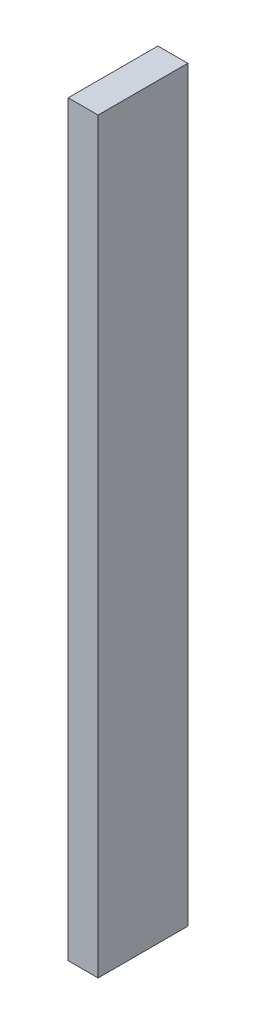
ISO-10303-21;
HEADER;
FILE_DESCRIPTION(('STEP AP214'),'2;1');
FILE_NAME('part.step','',(''),(''),'','','');
FILE_SCHEMA(('AUTOMOTIVE_DESIGN { 1 0 10303 214 1 1 1 1 }'));
ENDSEC;
DATA;
#1=APPLICATION_CONTEXT('core data for automotive mechanical design processes');
#2=APPLICATION_PROTOCOL_DEFINITION('international standard','automotive_design',2000,#1);
#3=PRODUCT_CONTEXT('',#1,'mechanical');
#4=PRODUCT('Part','Part','',(#3));
#5=PRODUCT_RELATED_PRODUCT_CATEGORY('part','',(#4));
#6=PRODUCT_DEFINITION_FORMATION('','',#4);
#7=PRODUCT_DEFINITION_CONTEXT('part definition',#1,'design');
#8=PRODUCT_DEFINITION('design','',#6,#7);
#9=PRODUCT_DEFINITION_SHAPE('','',#8);
#10=(LENGTH_UNIT() NAMED_UNIT(*) SI_UNIT(.MILLI.,.METRE.));
#11=(NAMED_UNIT(*) PLANE_ANGLE_UNIT() SI_UNIT($,.RADIAN.));
#12=(NAMED_UNIT(*) SI_UNIT($,.STERADIAN.) SOLID_ANGLE_UNIT());
#13=UNCERTAINTY_MEASURE_WITH_UNIT(LENGTH_MEASURE(1.E-05),#10,'distance_accuracy_value','');
#14=(GEOMETRIC_REPRESENTATION_CONTEXT(3) GLOBAL_UNCERTAINTY_ASSIGNED_CONTEXT((#13)) GLOBAL_UNIT_ASSIGNED_CONTEXT((#10,
#11,#12)) REPRESENTATION_CONTEXT('',''));
#15=CARTESIAN_POINT('',(0.,0.,0.));
#16=DIRECTION('',(0.,0.,1.));
#17=DIRECTION('',(1.,0.,0.));
#18=AXIS2_PLACEMENT_3D('',#15,#16,#17);
#19=CARTESIAN_POINT('',(10.,500.,30.));
#20=DIRECTION('',(-1.,0.,0.));
#21=DIRECTION('',(0.,0.,1.));
#22=AXIS2_PLACEMENT_3D('',#19,#20,#21);
#23=PLANE('',#22);
#24=DIRECTION('',(0.,0.,-1.));
#25=VECTOR('',#24,1.);
#26=CARTESIAN_POINT('',(10.,0.,30.));
#27=LINE('',#26,#25);
#28=CARTESIAN_POINT('',(10.,0.,30.));
#29=VERTEX_POINT('',#28);
#30=CARTESIAN_POINT('',(10.,0.,-30.));
#31=VERTEX_POINT('',#30);
#32=EDGE_CURVE('E107',#29,#31,#27,.T.);
#33=ORIENTED_EDGE('',*,*,#32,.T.);
#34=DIRECTION('',(0.,-1.,0.));
#35=VECTOR('',#34,1.);
#36=CARTESIAN_POINT('',(10.,500.,-30.));
#37=LINE('',#36,#35);
#38=CARTESIAN_POINT('',(10.,500.,-30.));
#39=VERTEX_POINT('',#38);
#40=EDGE_CURVE('E11',#39,#31,#37,.T.);
#41=ORIENTED_EDGE('',*,*,#40,.F.);
#42=DIRECTION('',(0.,0.,-1.));
#43=VECTOR('',#42,1.);
#44=CARTESIAN_POINT('',(10.,500.,30.));
#45=LINE('',#44,#43);
#46=CARTESIAN_POINT('',(10.,500.,30.));
#47=VERTEX_POINT('',#46);
#48=EDGE_CURVE('E91',#47,#39,#45,.T.);
#49=ORIENTED_EDGE('',*,*,#48,.F.);
#50=DIRECTION('',(0.,-1.,0.));
#51=VECTOR('',#50,1.);
#52=CARTESIAN_POINT('',(10.,500.,30.));
#53=LINE('',#52,#51);
#54=EDGE_CURVE('E103',#47,#29,#53,.T.);
#55=ORIENTED_EDGE('',*,*,#54,.T.);
#56=EDGE_LOOP('',(#33,#41,#49,#55));
#57=FACE_BOUND('',#56,.T.);
#58=ADVANCED_FACE('F39',(#57),#23,.F.);
#59=CARTESIAN_POINT('',(-10.,500.,-30.));
#60=DIRECTION('',(0.,0.,1.));
#61=DIRECTION('',(1.,0.,0.));
#62=AXIS2_PLACEMENT_3D('',#59,#60,#61);
#63=PLANE('',#62);
#64=DIRECTION('',(-1.,0.,0.));
#65=VECTOR('',#64,1.);
#66=CARTESIAN_POINT('',(-10.,0.,-30.));
#67=LINE('',#66,#65);
#68=CARTESIAN_POINT('',(-10.,0.,-30.));
#69=VERTEX_POINT('',#68);
#70=EDGE_CURVE('E96',#31,#69,#67,.T.);
#71=ORIENTED_EDGE('',*,*,#70,.T.);
#72=DIRECTION('',(0.,-1.,0.));
#73=VECTOR('',#72,1.);
#74=CARTESIAN_POINT('',(-10.,500.,-30.));
#75=LINE('',#74,#73);
#76=CARTESIAN_POINT('',(-10.,500.,-30.));
#77=VERTEX_POINT('',#76);
#78=EDGE_CURVE('E48',#77,#69,#75,.T.);
#79=ORIENTED_EDGE('',*,*,#78,.F.);
#80=DIRECTION('',(-1.,0.,0.));
#81=VECTOR('',#80,1.);
#82=CARTESIAN_POINT('',(-10.,500.,-30.));
#83=LINE('',#82,#81);
#84=EDGE_CURVE('E86',#39,#77,#83,.T.);
#85=ORIENTED_EDGE('',*,*,#84,.F.);
#86=ORIENTED_EDGE('',*,*,#40,.T.);
#87=EDGE_LOOP('',(#71,#79,#85,#86));
#88=FACE_BOUND('',#87,.T.);
#89=ADVANCED_FACE('F95',(#88),#63,.F.);
#90=CARTESIAN_POINT('',(-10.,500.,30.));
#91=DIRECTION('',(1.,0.,0.));
#92=DIRECTION('',(0.,0.,-1.));
#93=AXIS2_PLACEMENT_3D('',#90,#91,#92);
#94=PLANE('',#93);
#95=DIRECTION('',(0.,0.,1.));
#96=VECTOR('',#95,1.);
#97=CARTESIAN_POINT('',(-10.,0.,30.));
#98=LINE('',#97,#96);
#99=CARTESIAN_POINT('',(-10.,0.,30.));
#100=VERTEX_POINT('',#99);
#101=EDGE_CURVE('E73',#69,#100,#98,.T.);
#102=ORIENTED_EDGE('',*,*,#101,.T.);
#103=DIRECTION('',(0.,-1.,0.));
#104=VECTOR('',#103,1.);
#105=CARTESIAN_POINT('',(-10.,500.,30.));
#106=LINE('',#105,#104);
#107=CARTESIAN_POINT('',(-10.,500.,30.));
#108=VERTEX_POINT('',#107);
#109=EDGE_CURVE('E98',#108,#100,#106,.T.);
#110=ORIENTED_EDGE('',*,*,#109,.F.);
#111=DIRECTION('',(0.,0.,1.));
#112=VECTOR('',#111,1.);
#113=CARTESIAN_POINT('',(-10.,500.,30.));
#114=LINE('',#113,#112);
#115=EDGE_CURVE('E89',#77,#108,#114,.T.);
#116=ORIENTED_EDGE('',*,*,#115,.F.);
#117=ORIENTED_EDGE('',*,*,#78,.T.);
#118=EDGE_LOOP('',(#102,#110,#116,#117));
#119=FACE_BOUND('',#118,.T.);
#120=ADVANCED_FACE('F99',(#119),#94,.F.);
#121=CARTESIAN_POINT('',(-10.,500.,30.));
#122=DIRECTION('',(0.,0.,-1.));
#123=DIRECTION('',(-1.,0.,0.));
#124=AXIS2_PLACEMENT_3D('',#121,#122,#123);
#125=PLANE('',#124);
#126=DIRECTION('',(1.,0.,0.));
#127=VECTOR('',#126,1.);
#128=CARTESIAN_POINT('',(-10.,0.,30.));
#129=LINE('',#128,#127);
#130=EDGE_CURVE('E79',#100,#29,#129,.T.);
#131=ORIENTED_EDGE('',*,*,#130,.T.);
#132=ORIENTED_EDGE('',*,*,#54,.F.);
#133=DIRECTION('',(1.,0.,0.));
#134=VECTOR('',#133,1.);
#135=CARTESIAN_POINT('',(-10.,500.,30.));
#136=LINE('',#135,#134);
#137=EDGE_CURVE('E56',#108,#47,#136,.T.);
#138=ORIENTED_EDGE('',*,*,#137,.F.);
#139=ORIENTED_EDGE('',*,*,#109,.T.);
#140=EDGE_LOOP('',(#131,#132,#138,#139));
#141=FACE_BOUND('',#140,.T.);
#142=ADVANCED_FACE('F120',(#141),#125,.F.);
#143=CARTESIAN_POINT('',(0.,500.,0.));
#144=DIRECTION('',(0.,-1.,0.));
#145=DIRECTION('',(0.,0.,-1.));
#146=AXIS2_PLACEMENT_3D('',#143,#144,#145);
#147=PLANE('',#146);
#148=ORIENTED_EDGE('',*,*,#48,.T.);
#149=ORIENTED_EDGE('',*,*,#84,.T.);
#150=ORIENTED_EDGE('',*,*,#115,.T.);
#151=ORIENTED_EDGE('',*,*,#137,.T.);
#152=EDGE_LOOP('',(#148,#149,#150,#151));
#153=FACE_BOUND('',#152,.T.);
#154=ADVANCED_FACE('F87',(#153),#147,.F.);
#155=CARTESIAN_POINT('',(0.,0.,0.));
#156=DIRECTION('',(0.,-1.,0.));
#157=DIRECTION('',(0.,0.,-1.));
#158=AXIS2_PLACEMENT_3D('',#155,#156,#157);
#159=PLANE('',#158);
#160=ORIENTED_EDGE('',*,*,#32,.F.);
#161=ORIENTED_EDGE('',*,*,#130,.F.);
#162=ORIENTED_EDGE('',*,*,#101,.F.);
#163=ORIENTED_EDGE('',*,*,#70,.F.);
#164=EDGE_LOOP('',(#160,#161,#162,#163));
#165=FACE_BOUND('',#164,.T.);
#166=ADVANCED_FACE('F123',(#165),#159,.T.);
#167=CLOSED_SHELL('',(#58,#89,#120,#142,#154,#166));
#168=MANIFOLD_SOLID_BREP('B2',#167);
#169=ADVANCED_BREP_SHAPE_REPRESENTATION('',(#18,#168),#14);
#170=SHAPE_DEFINITION_REPRESENTATION(#9,#169);
ENDSEC;
END-ISO-10303-21;
